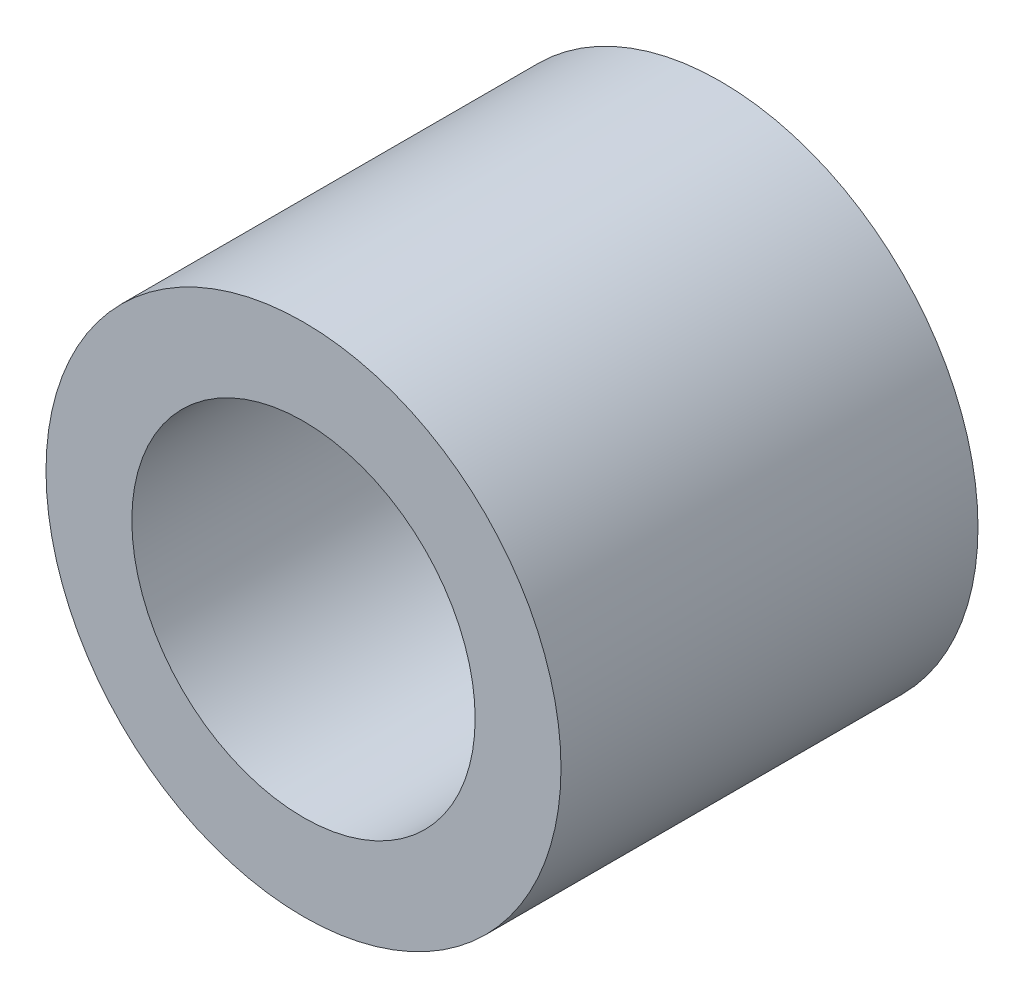
ISO-10303-21;
HEADER;
FILE_DESCRIPTION(('STEP AP214'),'2;1');
FILE_NAME('part.step','',(''),(''),'','','');
FILE_SCHEMA(('AUTOMOTIVE_DESIGN { 1 0 10303 214 1 1 1 1 }'));
ENDSEC;
DATA;
#1=APPLICATION_CONTEXT('core data for automotive mechanical design processes');
#2=APPLICATION_PROTOCOL_DEFINITION('international standard','automotive_design',2000,#1);
#3=PRODUCT_CONTEXT('',#1,'mechanical');
#4=PRODUCT('Part','Part','',(#3));
#5=PRODUCT_RELATED_PRODUCT_CATEGORY('part','',(#4));
#6=PRODUCT_DEFINITION_FORMATION('','',#4);
#7=PRODUCT_DEFINITION_CONTEXT('part definition',#1,'design');
#8=PRODUCT_DEFINITION('design','',#6,#7);
#9=PRODUCT_DEFINITION_SHAPE('','',#8);
#10=(LENGTH_UNIT() NAMED_UNIT(*) SI_UNIT(.MILLI.,.METRE.));
#11=(NAMED_UNIT(*) PLANE_ANGLE_UNIT() SI_UNIT($,.RADIAN.));
#12=(NAMED_UNIT(*) SI_UNIT($,.STERADIAN.) SOLID_ANGLE_UNIT());
#13=UNCERTAINTY_MEASURE_WITH_UNIT(LENGTH_MEASURE(1.E-05),#10,'distance_accuracy_value','');
#14=(GEOMETRIC_REPRESENTATION_CONTEXT(3) GLOBAL_UNCERTAINTY_ASSIGNED_CONTEXT((#13)) GLOBAL_UNIT_ASSIGNED_CONTEXT((#10,
#11,#12)) REPRESENTATION_CONTEXT('',''));
#15=CARTESIAN_POINT('',(0.,0.,0.));
#16=DIRECTION('',(0.,0.,1.));
#17=DIRECTION('',(1.,0.,0.));
#18=AXIS2_PLACEMENT_3D('',#15,#16,#17);
#19=CARTESIAN_POINT('',(0.,0.,7.71271));
#20=DIRECTION('',(0.,0.,1.));
#21=DIRECTION('',(1.,0.,0.));
#22=AXIS2_PLACEMENT_3D('',#19,#20,#21);
#23=PLANE('',#22);
#24=CARTESIAN_POINT('',(0.,0.,7.71271));
#25=DIRECTION('',(0.,0.,1.));
#26=DIRECTION('',(1.,0.,0.));
#27=AXIS2_PLACEMENT_3D('',#24,#25,#26);
#28=CIRCLE('',#27,9.525);
#29=CARTESIAN_POINT('',(9.525,0.,7.71271));
#30=VERTEX_POINT('',#29);
#31=EDGE_CURVE('E10',#30,#30,#28,.T.);
#32=ORIENTED_EDGE('',*,*,#31,.T.);
#33=EDGE_LOOP('',(#32));
#34=FACE_BOUND('',#33,.T.);
#35=CARTESIAN_POINT('',(0.,0.,7.71271));
#36=DIRECTION('',(0.,0.,1.));
#37=DIRECTION('',(1.,0.,0.));
#38=AXIS2_PLACEMENT_3D('',#35,#36,#37);
#39=CIRCLE('',#38,6.35);
#40=CARTESIAN_POINT('',(6.35,0.,7.71271));
#41=VERTEX_POINT('',#40);
#42=EDGE_CURVE('E56',#41,#41,#39,.T.);
#43=ORIENTED_EDGE('',*,*,#42,.F.);
#44=EDGE_LOOP('',(#43));
#45=FACE_BOUND('',#44,.T.);
#46=ADVANCED_FACE('F43',(#34,#45),#23,.T.);
#47=CARTESIAN_POINT('',(0.,0.,-7.71271));
#48=DIRECTION('',(0.,0.,1.));
#49=DIRECTION('',(1.,0.,0.));
#50=AXIS2_PLACEMENT_3D('',#47,#48,#49);
#51=PLANE('',#50);
#52=CARTESIAN_POINT('',(0.,0.,-7.71271));
#53=DIRECTION('',(0.,0.,1.));
#54=DIRECTION('',(1.,0.,0.));
#55=AXIS2_PLACEMENT_3D('',#52,#53,#54);
#56=CIRCLE('',#55,9.525);
#57=CARTESIAN_POINT('',(9.525,0.,-7.71271));
#58=VERTEX_POINT('',#57);
#59=EDGE_CURVE('E47',#58,#58,#56,.T.);
#60=ORIENTED_EDGE('',*,*,#59,.F.);
#61=EDGE_LOOP('',(#60));
#62=FACE_BOUND('',#61,.T.);
#63=CARTESIAN_POINT('',(0.,0.,-7.71271));
#64=DIRECTION('',(0.,0.,1.));
#65=DIRECTION('',(1.,0.,0.));
#66=AXIS2_PLACEMENT_3D('',#63,#64,#65);
#67=CIRCLE('',#66,6.35);
#68=CARTESIAN_POINT('',(6.35,0.,-7.71271));
#69=VERTEX_POINT('',#68);
#70=EDGE_CURVE('E58',#69,#69,#67,.T.);
#71=ORIENTED_EDGE('',*,*,#70,.T.);
#72=EDGE_LOOP('',(#71));
#73=FACE_BOUND('',#72,.T.);
#74=ADVANCED_FACE('F70',(#62,#73),#51,.F.);
#75=CARTESIAN_POINT('',(0.,0.,7.71271));
#76=DIRECTION('',(0.,0.,-1.));
#77=DIRECTION('',(-1.,0.,0.));
#78=AXIS2_PLACEMENT_3D('',#75,#76,#77);
#79=CYLINDRICAL_SURFACE('',#78,9.525);
#80=ORIENTED_EDGE('',*,*,#31,.F.);
#81=EDGE_LOOP('',(#80));
#82=FACE_BOUND('',#81,.T.);
#83=ORIENTED_EDGE('',*,*,#59,.T.);
#84=EDGE_LOOP('',(#83));
#85=FACE_BOUND('',#84,.T.);
#86=ADVANCED_FACE('F45',(#82,#85),#79,.T.);
#87=CARTESIAN_POINT('',(0.,0.,7.71271));
#88=DIRECTION('',(0.,0.,-1.));
#89=DIRECTION('',(-1.,0.,0.));
#90=AXIS2_PLACEMENT_3D('',#87,#88,#89);
#91=CYLINDRICAL_SURFACE('',#90,6.35);
#92=ORIENTED_EDGE('',*,*,#42,.T.);
#93=EDGE_LOOP('',(#92));
#94=FACE_BOUND('',#93,.T.);
#95=ORIENTED_EDGE('',*,*,#70,.F.);
#96=EDGE_LOOP('',(#95));
#97=FACE_BOUND('',#96,.T.);
#98=ADVANCED_FACE('F66',(#94,#97),#91,.F.);
#99=CLOSED_SHELL('',(#46,#74,#86,#98));
#100=MANIFOLD_SOLID_BREP('B2',#99);
#101=ADVANCED_BREP_SHAPE_REPRESENTATION('',(#18,#100),#14);
#102=SHAPE_DEFINITION_REPRESENTATION(#9,#101);
ENDSEC;
END-ISO-10303-21;
